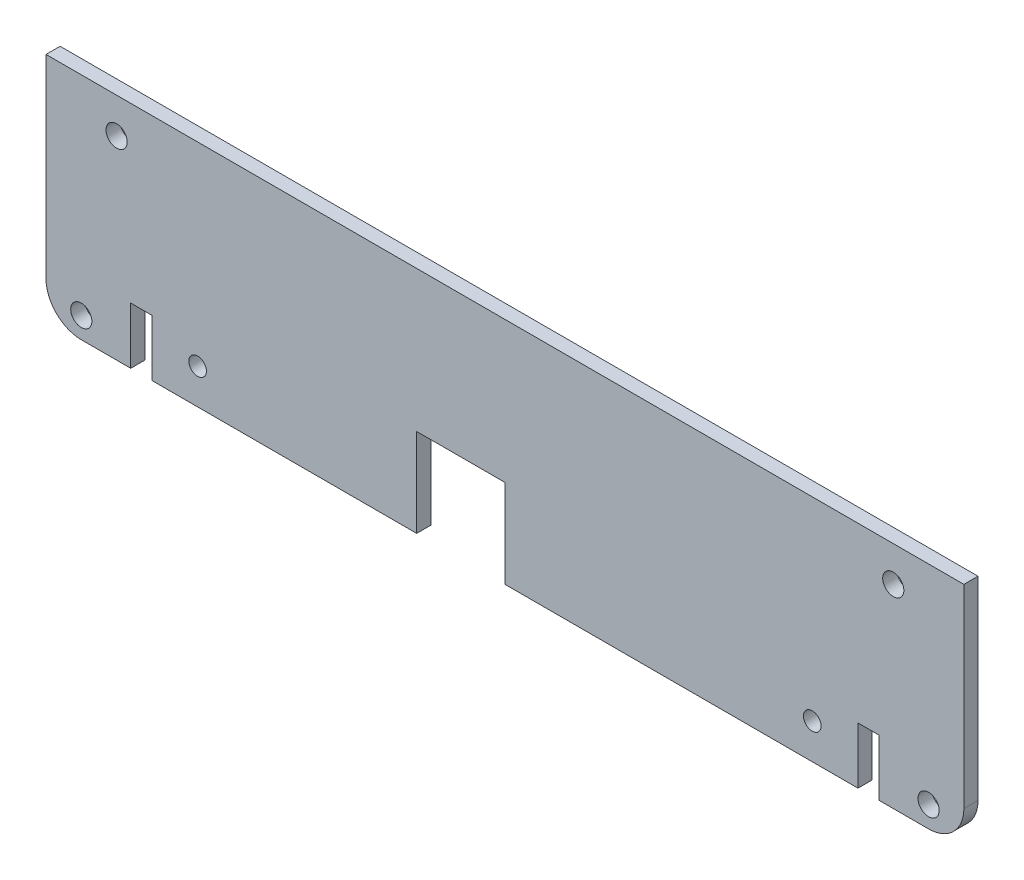
ISO-10303-21;
HEADER;
FILE_DESCRIPTION(('STEP AP214'),'2;1');
FILE_NAME('part.step','',(''),(''),'','','');
FILE_SCHEMA(('AUTOMOTIVE_DESIGN { 1 0 10303 214 1 1 1 1 }'));
ENDSEC;
DATA;
#1=APPLICATION_CONTEXT('core data for automotive mechanical design processes');
#2=APPLICATION_PROTOCOL_DEFINITION('international standard','automotive_design',2000,#1);
#3=PRODUCT_CONTEXT('',#1,'mechanical');
#4=PRODUCT('Part','Part','',(#3));
#5=PRODUCT_RELATED_PRODUCT_CATEGORY('part','',(#4));
#6=PRODUCT_DEFINITION_FORMATION('','',#4);
#7=PRODUCT_DEFINITION_CONTEXT('part definition',#1,'design');
#8=PRODUCT_DEFINITION('design','',#6,#7);
#9=PRODUCT_DEFINITION_SHAPE('','',#8);
#10=(LENGTH_UNIT() NAMED_UNIT(*) SI_UNIT(.MILLI.,.METRE.));
#11=(NAMED_UNIT(*) PLANE_ANGLE_UNIT() SI_UNIT($,.RADIAN.));
#12=(NAMED_UNIT(*) SI_UNIT($,.STERADIAN.) SOLID_ANGLE_UNIT());
#13=UNCERTAINTY_MEASURE_WITH_UNIT(LENGTH_MEASURE(1.E-05),#10,'distance_accuracy_value','');
#14=(GEOMETRIC_REPRESENTATION_CONTEXT(3) GLOBAL_UNCERTAINTY_ASSIGNED_CONTEXT((#13)) GLOBAL_UNIT_ASSIGNED_CONTEXT((#10,
#11,#12)) REPRESENTATION_CONTEXT('',''));
#15=CARTESIAN_POINT('',(0.,0.,0.));
#16=DIRECTION('',(0.,0.,1.));
#17=DIRECTION('',(1.,0.,0.));
#18=AXIS2_PLACEMENT_3D('',#15,#16,#17);
#19=CARTESIAN_POINT('',(-130.,-32.5,4.));
#20=DIRECTION('',(0.,1.,0.));
#21=DIRECTION('',(0.,0.,1.));
#22=AXIS2_PLACEMENT_3D('',#19,#20,#21);
#23=PLANE('',#22);
#24=DIRECTION('',(1.,0.,0.));
#25=VECTOR('',#24,1.);
#26=CARTESIAN_POINT('',(-130.,-32.5,4.));
#27=LINE('',#26,#25);
#28=CARTESIAN_POINT('',(-100.,-32.5,4.));
#29=VERTEX_POINT('',#28);
#30=CARTESIAN_POINT('',(-25.,-32.5,4.));
#31=VERTEX_POINT('',#30);
#32=EDGE_CURVE('E184',#29,#31,#27,.T.);
#33=ORIENTED_EDGE('',*,*,#32,.F.);
#34=DIRECTION('',(0.,0.,-1.));
#35=VECTOR('',#34,1.);
#36=CARTESIAN_POINT('',(-100.,-32.5,4.));
#37=LINE('',#36,#35);
#38=CARTESIAN_POINT('',(-100.,-32.5,0.));
#39=VERTEX_POINT('',#38);
#40=EDGE_CURVE('E274',#29,#39,#37,.T.);
#41=ORIENTED_EDGE('',*,*,#40,.T.);
#42=DIRECTION('',(1.,0.,0.));
#43=VECTOR('',#42,1.);
#44=CARTESIAN_POINT('',(-130.,-32.5,0.));
#45=LINE('',#44,#43);
#46=CARTESIAN_POINT('',(-25.,-32.5,0.));
#47=VERTEX_POINT('',#46);
#48=EDGE_CURVE('E333',#39,#47,#45,.T.);
#49=ORIENTED_EDGE('',*,*,#48,.T.);
#50=DIRECTION('',(0.,0.,-1.));
#51=VECTOR('',#50,1.);
#52=CARTESIAN_POINT('',(-25.,-32.5,10.));
#53=LINE('',#52,#51);
#54=EDGE_CURVE('E243',#31,#47,#53,.T.);
#55=ORIENTED_EDGE('',*,*,#54,.F.);
#56=EDGE_LOOP('',(#33,#41,#49,#55));
#57=FACE_BOUND('',#56,.T.);
#58=ADVANCED_FACE('F32',(#57),#23,.F.);
#59=CARTESIAN_POINT('',(106.,-32.5,4.));
#60=VERTEX_POINT('',#59);
#61=CARTESIAN_POINT('',(120.,-32.5,4.));
#62=VERTEX_POINT('',#61);
#63=EDGE_CURVE('E190',#60,#62,#27,.T.);
#64=ORIENTED_EDGE('',*,*,#63,.F.);
#65=DIRECTION('',(0.,0.,-1.));
#66=VECTOR('',#65,1.);
#67=CARTESIAN_POINT('',(106.,-32.5,4.));
#68=LINE('',#67,#66);
#69=CARTESIAN_POINT('',(106.,-32.5,0.));
#70=VERTEX_POINT('',#69);
#71=EDGE_CURVE('E258',#60,#70,#68,.T.);
#72=ORIENTED_EDGE('',*,*,#71,.T.);
#73=CARTESIAN_POINT('',(120.,-32.5,0.));
#74=VERTEX_POINT('',#73);
#75=EDGE_CURVE('E340',#70,#74,#45,.T.);
#76=ORIENTED_EDGE('',*,*,#75,.T.);
#77=DIRECTION('',(0.,0.,-1.));
#78=VECTOR('',#77,1.);
#79=CARTESIAN_POINT('',(120.,-32.5,4.));
#80=LINE('',#79,#78);
#81=EDGE_CURVE('E365',#74,#62,#80,.F.);
#82=ORIENTED_EDGE('',*,*,#81,.T.);
#83=EDGE_LOOP('',(#64,#72,#76,#82));
#84=FACE_BOUND('',#83,.T.);
#85=ADVANCED_FACE('F386',(#84),#23,.F.);
#86=CARTESIAN_POINT('',(0.,-32.5,0.));
#87=VERTEX_POINT('',#86);
#88=CARTESIAN_POINT('',(100.,-32.5,0.));
#89=VERTEX_POINT('',#88);
#90=EDGE_CURVE('E338',#87,#89,#45,.T.);
#91=ORIENTED_EDGE('',*,*,#90,.T.);
#92=DIRECTION('',(0.,0.,-1.));
#93=VECTOR('',#92,1.);
#94=CARTESIAN_POINT('',(100.,-32.5,4.));
#95=LINE('',#94,#93);
#96=CARTESIAN_POINT('',(100.,-32.5,4.));
#97=VERTEX_POINT('',#96);
#98=EDGE_CURVE('E55',#97,#89,#95,.T.);
#99=ORIENTED_EDGE('',*,*,#98,.F.);
#100=CARTESIAN_POINT('',(0.,-32.5,4.));
#101=VERTEX_POINT('',#100);
#102=EDGE_CURVE('E186',#101,#97,#27,.T.);
#103=ORIENTED_EDGE('',*,*,#102,.F.);
#104=DIRECTION('',(0.,0.,-1.));
#105=VECTOR('',#104,1.);
#106=CARTESIAN_POINT('',(0.,-32.5,10.));
#107=LINE('',#106,#105);
#108=EDGE_CURVE('E240',#101,#87,#107,.T.);
#109=ORIENTED_EDGE('',*,*,#108,.T.);
#110=EDGE_LOOP('',(#91,#99,#103,#109));
#111=FACE_BOUND('',#110,.T.);
#112=ADVANCED_FACE('F388',(#111),#23,.F.);
#113=CARTESIAN_POINT('',(130.,32.5,4.));
#114=DIRECTION('',(-1.,0.,0.));
#115=DIRECTION('',(0.,0.,1.));
#116=AXIS2_PLACEMENT_3D('',#113,#114,#115);
#117=PLANE('',#116);
#118=DIRECTION('',(0.,1.,0.));
#119=VECTOR('',#118,1.);
#120=CARTESIAN_POINT('',(130.,32.5,4.));
#121=LINE('',#120,#119);
#122=CARTESIAN_POINT('',(130.,-22.5,4.));
#123=VERTEX_POINT('',#122);
#124=CARTESIAN_POINT('',(130.,32.5,4.));
#125=VERTEX_POINT('',#124);
#126=EDGE_CURVE('E203',#123,#125,#121,.T.);
#127=ORIENTED_EDGE('',*,*,#126,.F.);
#128=DIRECTION('',(0.,0.,-1.));
#129=VECTOR('',#128,1.);
#130=CARTESIAN_POINT('',(130.,-22.5,4.));
#131=LINE('',#130,#129);
#132=CARTESIAN_POINT('',(130.,-22.5,0.));
#133=VERTEX_POINT('',#132);
#134=EDGE_CURVE('E11',#123,#133,#131,.T.);
#135=ORIENTED_EDGE('',*,*,#134,.T.);
#136=DIRECTION('',(0.,1.,0.));
#137=VECTOR('',#136,1.);
#138=CARTESIAN_POINT('',(130.,32.5,0.));
#139=LINE('',#138,#137);
#140=CARTESIAN_POINT('',(130.,32.5,0.));
#141=VERTEX_POINT('',#140);
#142=EDGE_CURVE('E214',#133,#141,#139,.T.);
#143=ORIENTED_EDGE('',*,*,#142,.T.);
#144=DIRECTION('',(0.,0.,-1.));
#145=VECTOR('',#144,1.);
#146=CARTESIAN_POINT('',(130.,32.5,4.));
#147=LINE('',#146,#145);
#148=EDGE_CURVE('E188',#125,#141,#147,.T.);
#149=ORIENTED_EDGE('',*,*,#148,.F.);
#150=EDGE_LOOP('',(#127,#135,#143,#149));
#151=FACE_BOUND('',#150,.T.);
#152=ADVANCED_FACE('F358',(#151),#117,.F.);
#153=CARTESIAN_POINT('',(-130.,32.5,4.));
#154=DIRECTION('',(0.,-1.,0.));
#155=DIRECTION('',(0.,0.,-1.));
#156=AXIS2_PLACEMENT_3D('',#153,#154,#155);
#157=PLANE('',#156);
#158=DIRECTION('',(-1.,0.,0.));
#159=VECTOR('',#158,1.);
#160=CARTESIAN_POINT('',(-130.,32.5,0.));
#161=LINE('',#160,#159);
#162=CARTESIAN_POINT('',(-130.,32.5,0.));
#163=VERTEX_POINT('',#162);
#164=EDGE_CURVE('E348',#141,#163,#161,.T.);
#165=ORIENTED_EDGE('',*,*,#164,.T.);
#166=DIRECTION('',(0.,0.,-1.));
#167=VECTOR('',#166,1.);
#168=CARTESIAN_POINT('',(-130.,32.5,4.));
#169=LINE('',#168,#167);
#170=CARTESIAN_POINT('',(-130.,32.5,4.));
#171=VERTEX_POINT('',#170);
#172=EDGE_CURVE('E183',#171,#163,#169,.T.);
#173=ORIENTED_EDGE('',*,*,#172,.F.);
#174=DIRECTION('',(-1.,0.,0.));
#175=VECTOR('',#174,1.);
#176=CARTESIAN_POINT('',(-130.,32.5,4.));
#177=LINE('',#176,#175);
#178=EDGE_CURVE('E201',#125,#171,#177,.T.);
#179=ORIENTED_EDGE('',*,*,#178,.F.);
#180=ORIENTED_EDGE('',*,*,#148,.T.);
#181=EDGE_LOOP('',(#165,#173,#179,#180));
#182=FACE_BOUND('',#181,.T.);
#183=ADVANCED_FACE('F364',(#182),#157,.F.);
#184=CARTESIAN_POINT('',(-130.,32.5,4.));
#185=DIRECTION('',(1.,0.,0.));
#186=DIRECTION('',(0.,0.,-1.));
#187=AXIS2_PLACEMENT_3D('',#184,#185,#186);
#188=PLANE('',#187);
#189=DIRECTION('',(0.,-1.,0.));
#190=VECTOR('',#189,1.);
#191=CARTESIAN_POINT('',(-130.,32.5,0.));
#192=LINE('',#191,#190);
#193=CARTESIAN_POINT('',(-130.,-22.5,0.));
#194=VERTEX_POINT('',#193);
#195=EDGE_CURVE('E343',#163,#194,#192,.T.);
#196=ORIENTED_EDGE('',*,*,#195,.T.);
#197=DIRECTION('',(0.,0.,-1.));
#198=VECTOR('',#197,1.);
#199=CARTESIAN_POINT('',(-130.,-22.5,4.));
#200=LINE('',#199,#198);
#201=CARTESIAN_POINT('',(-130.,-22.5,4.));
#202=VERTEX_POINT('',#201);
#203=EDGE_CURVE('E375',#194,#202,#200,.F.);
#204=ORIENTED_EDGE('',*,*,#203,.T.);
#205=DIRECTION('',(0.,-1.,0.));
#206=VECTOR('',#205,1.);
#207=CARTESIAN_POINT('',(-130.,32.5,4.));
#208=LINE('',#207,#206);
#209=EDGE_CURVE('E197',#171,#202,#208,.T.);
#210=ORIENTED_EDGE('',*,*,#209,.F.);
#211=ORIENTED_EDGE('',*,*,#172,.T.);
#212=EDGE_LOOP('',(#196,#204,#210,#211));
#213=FACE_BOUND('',#212,.T.);
#214=ADVANCED_FACE('F397',(#213),#188,.F.);
#215=CARTESIAN_POINT('',(-120.,-32.5,0.));
#216=VERTEX_POINT('',#215);
#217=CARTESIAN_POINT('',(-106.,-32.5,0.));
#218=VERTEX_POINT('',#217);
#219=EDGE_CURVE('E175',#216,#218,#45,.T.);
#220=ORIENTED_EDGE('',*,*,#219,.T.);
#221=DIRECTION('',(0.,0.,-1.));
#222=VECTOR('',#221,1.);
#223=CARTESIAN_POINT('',(-106.,-32.5,4.));
#224=LINE('',#223,#222);
#225=CARTESIAN_POINT('',(-106.,-32.5,4.));
#226=VERTEX_POINT('',#225);
#227=EDGE_CURVE('E47',#226,#218,#224,.T.);
#228=ORIENTED_EDGE('',*,*,#227,.F.);
#229=CARTESIAN_POINT('',(-120.,-32.5,4.));
#230=VERTEX_POINT('',#229);
#231=EDGE_CURVE('E172',#230,#226,#27,.T.);
#232=ORIENTED_EDGE('',*,*,#231,.F.);
#233=DIRECTION('',(0.,0.,-1.));
#234=VECTOR('',#233,1.);
#235=CARTESIAN_POINT('',(-120.,-32.5,4.));
#236=LINE('',#235,#234);
#237=EDGE_CURVE('E367',#230,#216,#236,.T.);
#238=ORIENTED_EDGE('',*,*,#237,.T.);
#239=EDGE_LOOP('',(#220,#228,#232,#238));
#240=FACE_BOUND('',#239,.T.);
#241=ADVANCED_FACE('F170',(#240),#23,.F.);
#242=CARTESIAN_POINT('',(0.,0.,4.));
#243=DIRECTION('',(0.,0.,1.));
#244=DIRECTION('',(1.,0.,0.));
#245=AXIS2_PLACEMENT_3D('',#242,#243,#244);
#246=PLANE('',#245);
#247=CARTESIAN_POINT('',(87.05,-22.5000000000007,4.));
#248=DIRECTION('',(0.,0.,-1.));
#249=DIRECTION('',(-1.,0.,0.));
#250=AXIS2_PLACEMENT_3D('',#247,#248,#249);
#251=CIRCLE('',#250,2.50000000000011);
#252=CARTESIAN_POINT('',(84.5499999999999,-22.5000000000007,4.));
#253=VERTEX_POINT('',#252);
#254=EDGE_CURVE('E297',#253,#253,#251,.T.);
#255=ORIENTED_EDGE('',*,*,#254,.T.);
#256=EDGE_LOOP('',(#255));
#257=FACE_BOUND('',#256,.T.);
#258=CARTESIAN_POINT('',(-87.05,-22.5000000000007,4.));
#259=DIRECTION('',(0.,0.,-1.));
#260=DIRECTION('',(-1.,0.,0.));
#261=AXIS2_PLACEMENT_3D('',#258,#259,#260);
#262=CIRCLE('',#261,2.50000000000019);
#263=CARTESIAN_POINT('',(-89.5500000000002,-22.5000000000007,4.));
#264=VERTEX_POINT('',#263);
#265=EDGE_CURVE('E291',#264,#264,#262,.T.);
#266=ORIENTED_EDGE('',*,*,#265,.T.);
#267=EDGE_LOOP('',(#266));
#268=FACE_BOUND('',#267,.T.);
#269=DIRECTION('',(0.,-1.,0.));
#270=VECTOR('',#269,1.);
#271=CARTESIAN_POINT('',(-100.,-32.5,4.));
#272=LINE('',#271,#270);
#273=CARTESIAN_POINT('',(-100.,-16.5,4.));
#274=VERTEX_POINT('',#273);
#275=EDGE_CURVE('E176',#274,#29,#272,.T.);
#276=ORIENTED_EDGE('',*,*,#275,.T.);
#277=ORIENTED_EDGE('',*,*,#32,.T.);
#278=DIRECTION('',(0.,-1.,0.));
#279=VECTOR('',#278,1.);
#280=CARTESIAN_POINT('',(-25.,0.,4.));
#281=LINE('',#280,#279);
#282=CARTESIAN_POINT('',(-25.,-7.49999999999998,4.));
#283=VERTEX_POINT('',#282);
#284=EDGE_CURVE('E236',#283,#31,#281,.T.);
#285=ORIENTED_EDGE('',*,*,#284,.F.);
#286=DIRECTION('',(-1.,0.,0.));
#287=VECTOR('',#286,1.);
#288=CARTESIAN_POINT('',(0.,-7.49999999999998,4.));
#289=LINE('',#288,#287);
#290=CARTESIAN_POINT('',(0.,-7.49999999999998,4.));
#291=VERTEX_POINT('',#290);
#292=EDGE_CURVE('E234',#291,#283,#289,.T.);
#293=ORIENTED_EDGE('',*,*,#292,.F.);
#294=DIRECTION('',(0.,1.,0.));
#295=VECTOR('',#294,1.);
#296=CARTESIAN_POINT('',(0.,0.,4.));
#297=LINE('',#296,#295);
#298=EDGE_CURVE('E225',#101,#291,#297,.T.);
#299=ORIENTED_EDGE('',*,*,#298,.F.);
#300=ORIENTED_EDGE('',*,*,#102,.T.);
#301=DIRECTION('',(0.,1.,0.));
#302=VECTOR('',#301,1.);
#303=CARTESIAN_POINT('',(100.,-32.5,4.));
#304=LINE('',#303,#302);
#305=CARTESIAN_POINT('',(100.,-16.5,4.));
#306=VERTEX_POINT('',#305);
#307=EDGE_CURVE('E277',#97,#306,#304,.T.);
#308=ORIENTED_EDGE('',*,*,#307,.T.);
#309=DIRECTION('',(1.,0.,0.));
#310=VECTOR('',#309,1.);
#311=CARTESIAN_POINT('',(106.,-16.5,4.));
#312=LINE('',#311,#310);
#313=CARTESIAN_POINT('',(106.,-16.5,4.));
#314=VERTEX_POINT('',#313);
#315=EDGE_CURVE('E261',#306,#314,#312,.T.);
#316=ORIENTED_EDGE('',*,*,#315,.T.);
#317=DIRECTION('',(0.,-1.,0.));
#318=VECTOR('',#317,1.);
#319=CARTESIAN_POINT('',(106.,-32.5,4.));
#320=LINE('',#319,#318);
#321=EDGE_CURVE('E269',#314,#60,#320,.T.);
#322=ORIENTED_EDGE('',*,*,#321,.T.);
#323=ORIENTED_EDGE('',*,*,#63,.T.);
#324=CARTESIAN_POINT('',(120.,-22.5,4.));
#325=DIRECTION('',(0.,0.,1.));
#326=DIRECTION('',(1.,0.,0.));
#327=AXIS2_PLACEMENT_3D('',#324,#325,#326);
#328=CIRCLE('',#327,10.);
#329=EDGE_CURVE('E377',#62,#123,#328,.T.);
#330=ORIENTED_EDGE('',*,*,#329,.T.);
#331=ORIENTED_EDGE('',*,*,#126,.T.);
#332=ORIENTED_EDGE('',*,*,#178,.T.);
#333=ORIENTED_EDGE('',*,*,#209,.T.);
#334=CARTESIAN_POINT('',(-120.,-22.5,4.));
#335=DIRECTION('',(0.,0.,1.));
#336=DIRECTION('',(1.,0.,0.));
#337=AXIS2_PLACEMENT_3D('',#334,#335,#336);
#338=CIRCLE('',#337,10.);
#339=EDGE_CURVE('E40',#202,#230,#338,.T.);
#340=ORIENTED_EDGE('',*,*,#339,.T.);
#341=ORIENTED_EDGE('',*,*,#231,.T.);
#342=DIRECTION('',(0.,1.,0.));
#343=VECTOR('',#342,1.);
#344=CARTESIAN_POINT('',(-106.,-32.5,4.));
#345=LINE('',#344,#343);
#346=CARTESIAN_POINT('',(-106.,-16.5,4.));
#347=VERTEX_POINT('',#346);
#348=EDGE_CURVE('E157',#226,#347,#345,.T.);
#349=ORIENTED_EDGE('',*,*,#348,.T.);
#350=DIRECTION('',(1.,0.,0.));
#351=VECTOR('',#350,1.);
#352=CARTESIAN_POINT('',(-106.,-16.5,4.));
#353=LINE('',#352,#351);
#354=EDGE_CURVE('E164',#347,#274,#353,.T.);
#355=ORIENTED_EDGE('',*,*,#354,.T.);
#356=EDGE_LOOP('',(#276,#277,#285,#293,#299,#300,#308,#316,#322,#323,#330,#331,#332,#333,#340,
#341,#349,#355));
#357=FACE_BOUND('',#356,.T.);
#358=CARTESIAN_POINT('',(120.,-26.5,4.));
#359=DIRECTION('',(0.,0.,-1.));
#360=DIRECTION('',(-1.,0.,0.));
#361=AXIS2_PLACEMENT_3D('',#358,#359,#360);
#362=CIRCLE('',#361,3.00000000000001);
#363=CARTESIAN_POINT('',(117.,-26.5,4.));
#364=VERTEX_POINT('',#363);
#365=EDGE_CURVE('E224',#364,#364,#362,.T.);
#366=ORIENTED_EDGE('',*,*,#365,.T.);
#367=EDGE_LOOP('',(#366));
#368=FACE_BOUND('',#367,.T.);
#369=CARTESIAN_POINT('',(-110.,22.4999999999999,4.));
#370=DIRECTION('',(0.,0.,-1.));
#371=DIRECTION('',(-1.,0.,0.));
#372=AXIS2_PLACEMENT_3D('',#369,#370,#371);
#373=CIRCLE('',#372,3.00000000000001);
#374=CARTESIAN_POINT('',(-113.,22.4999999999999,4.));
#375=VERTEX_POINT('',#374);
#376=EDGE_CURVE('E218',#375,#375,#373,.T.);
#377=ORIENTED_EDGE('',*,*,#376,.T.);
#378=EDGE_LOOP('',(#377));
#379=FACE_BOUND('',#378,.T.);
#380=CARTESIAN_POINT('',(110.,22.5,4.));
#381=DIRECTION('',(0.,0.,-1.));
#382=DIRECTION('',(-1.,0.,0.));
#383=AXIS2_PLACEMENT_3D('',#380,#381,#382);
#384=CIRCLE('',#383,3.);
#385=CARTESIAN_POINT('',(107.,22.5,4.));
#386=VERTEX_POINT('',#385);
#387=EDGE_CURVE('E211',#386,#386,#384,.T.);
#388=ORIENTED_EDGE('',*,*,#387,.T.);
#389=EDGE_LOOP('',(#388));
#390=FACE_BOUND('',#389,.T.);
#391=CARTESIAN_POINT('',(-120.,-26.5,4.));
#392=DIRECTION('',(0.,0.,-1.));
#393=DIRECTION('',(-1.,0.,0.));
#394=AXIS2_PLACEMENT_3D('',#391,#392,#393);
#395=CIRCLE('',#394,2.99999999999999);
#396=CARTESIAN_POINT('',(-123.,-26.5,4.));
#397=VERTEX_POINT('',#396);
#398=EDGE_CURVE('E210',#397,#397,#395,.T.);
#399=ORIENTED_EDGE('',*,*,#398,.T.);
#400=EDGE_LOOP('',(#399));
#401=FACE_BOUND('',#400,.T.);
#402=ADVANCED_FACE('F179',(#257,#268,#357,#368,#379,#390,#401),#246,.T.);
#403=CARTESIAN_POINT('',(0.,0.,0.));
#404=DIRECTION('',(0.,0.,1.));
#405=DIRECTION('',(1.,0.,0.));
#406=AXIS2_PLACEMENT_3D('',#403,#404,#405);
#407=PLANE('',#406);
#408=CARTESIAN_POINT('',(87.05,-22.5000000000007,0.));
#409=DIRECTION('',(0.,0.,-1.));
#410=DIRECTION('',(-1.,0.,0.));
#411=AXIS2_PLACEMENT_3D('',#408,#409,#410);
#412=CIRCLE('',#411,2.50000000000011);
#413=CARTESIAN_POINT('',(84.5499999999999,-22.5000000000007,0.));
#414=VERTEX_POINT('',#413);
#415=EDGE_CURVE('E300',#414,#414,#412,.T.);
#416=ORIENTED_EDGE('',*,*,#415,.F.);
#417=EDGE_LOOP('',(#416));
#418=FACE_BOUND('',#417,.T.);
#419=CARTESIAN_POINT('',(-87.05,-22.5000000000007,0.));
#420=DIRECTION('',(0.,0.,-1.));
#421=DIRECTION('',(-1.,0.,0.));
#422=AXIS2_PLACEMENT_3D('',#419,#420,#421);
#423=CIRCLE('',#422,2.50000000000019);
#424=CARTESIAN_POINT('',(-89.5500000000002,-22.5000000000007,0.));
#425=VERTEX_POINT('',#424);
#426=EDGE_CURVE('E294',#425,#425,#423,.T.);
#427=ORIENTED_EDGE('',*,*,#426,.F.);
#428=EDGE_LOOP('',(#427));
#429=FACE_BOUND('',#428,.T.);
#430=CARTESIAN_POINT('',(120.,-26.5,0.));
#431=DIRECTION('',(0.,0.,-1.));
#432=DIRECTION('',(-1.,0.,0.));
#433=AXIS2_PLACEMENT_3D('',#430,#431,#432);
#434=CIRCLE('',#433,3.00000000000001);
#435=CARTESIAN_POINT('',(117.,-26.5,0.));
#436=VERTEX_POINT('',#435);
#437=EDGE_CURVE('E221',#436,#436,#434,.T.);
#438=ORIENTED_EDGE('',*,*,#437,.F.);
#439=EDGE_LOOP('',(#438));
#440=FACE_BOUND('',#439,.T.);
#441=CARTESIAN_POINT('',(-110.,22.4999999999999,0.));
#442=DIRECTION('',(0.,0.,-1.));
#443=DIRECTION('',(-1.,0.,0.));
#444=AXIS2_PLACEMENT_3D('',#441,#442,#443);
#445=CIRCLE('',#444,3.00000000000001);
#446=CARTESIAN_POINT('',(-113.,22.4999999999999,0.));
#447=VERTEX_POINT('',#446);
#448=EDGE_CURVE('E228',#447,#447,#445,.T.);
#449=ORIENTED_EDGE('',*,*,#448,.F.);
#450=EDGE_LOOP('',(#449));
#451=FACE_BOUND('',#450,.T.);
#452=CARTESIAN_POINT('',(110.,22.5,0.));
#453=DIRECTION('',(0.,0.,-1.));
#454=DIRECTION('',(-1.,0.,0.));
#455=AXIS2_PLACEMENT_3D('',#452,#453,#454);
#456=CIRCLE('',#455,3.);
#457=CARTESIAN_POINT('',(107.,22.5,0.));
#458=VERTEX_POINT('',#457);
#459=EDGE_CURVE('E215',#458,#458,#456,.T.);
#460=ORIENTED_EDGE('',*,*,#459,.F.);
#461=EDGE_LOOP('',(#460));
#462=FACE_BOUND('',#461,.T.);
#463=CARTESIAN_POINT('',(-120.,-26.5,0.));
#464=DIRECTION('',(0.,0.,-1.));
#465=DIRECTION('',(-1.,0.,0.));
#466=AXIS2_PLACEMENT_3D('',#463,#464,#465);
#467=CIRCLE('',#466,2.99999999999999);
#468=CARTESIAN_POINT('',(-123.,-26.5,0.));
#469=VERTEX_POINT('',#468);
#470=EDGE_CURVE('E207',#469,#469,#467,.T.);
#471=ORIENTED_EDGE('',*,*,#470,.F.);
#472=EDGE_LOOP('',(#471));
#473=FACE_BOUND('',#472,.T.);
#474=ORIENTED_EDGE('',*,*,#48,.F.);
#475=DIRECTION('',(0.,-1.,0.));
#476=VECTOR('',#475,1.);
#477=CARTESIAN_POINT('',(-100.,-32.5,0.));
#478=LINE('',#477,#476);
#479=CARTESIAN_POINT('',(-100.,-16.5,0.));
#480=VERTEX_POINT('',#479);
#481=EDGE_CURVE('E165',#480,#39,#478,.T.);
#482=ORIENTED_EDGE('',*,*,#481,.F.);
#483=DIRECTION('',(1.,0.,0.));
#484=VECTOR('',#483,1.);
#485=CARTESIAN_POINT('',(-106.,-16.5,0.));
#486=LINE('',#485,#484);
#487=CARTESIAN_POINT('',(-106.,-16.5,0.));
#488=VERTEX_POINT('',#487);
#489=EDGE_CURVE('E286',#488,#480,#486,.T.);
#490=ORIENTED_EDGE('',*,*,#489,.F.);
#491=DIRECTION('',(0.,1.,0.));
#492=VECTOR('',#491,1.);
#493=CARTESIAN_POINT('',(-106.,-32.5,0.));
#494=LINE('',#493,#492);
#495=EDGE_CURVE('E289',#218,#488,#494,.T.);
#496=ORIENTED_EDGE('',*,*,#495,.F.);
#497=ORIENTED_EDGE('',*,*,#219,.F.);
#498=CARTESIAN_POINT('',(-120.,-22.5,0.));
#499=DIRECTION('',(0.,0.,1.));
#500=DIRECTION('',(1.,0.,0.));
#501=AXIS2_PLACEMENT_3D('',#498,#499,#500);
#502=CIRCLE('',#501,10.);
#503=EDGE_CURVE('E373',#216,#194,#502,.F.);
#504=ORIENTED_EDGE('',*,*,#503,.T.);
#505=ORIENTED_EDGE('',*,*,#195,.F.);
#506=ORIENTED_EDGE('',*,*,#164,.F.);
#507=ORIENTED_EDGE('',*,*,#142,.F.);
#508=CARTESIAN_POINT('',(120.,-22.5,0.));
#509=DIRECTION('',(0.,0.,1.));
#510=DIRECTION('',(1.,0.,0.));
#511=AXIS2_PLACEMENT_3D('',#508,#509,#510);
#512=CIRCLE('',#511,10.);
#513=EDGE_CURVE('E371',#133,#74,#512,.F.);
#514=ORIENTED_EDGE('',*,*,#513,.T.);
#515=ORIENTED_EDGE('',*,*,#75,.F.);
#516=DIRECTION('',(0.,-1.,0.));
#517=VECTOR('',#516,1.);
#518=CARTESIAN_POINT('',(106.,-32.5,0.));
#519=LINE('',#518,#517);
#520=CARTESIAN_POINT('',(106.,-16.5,0.));
#521=VERTEX_POINT('',#520);
#522=EDGE_CURVE('E272',#521,#70,#519,.T.);
#523=ORIENTED_EDGE('',*,*,#522,.F.);
#524=DIRECTION('',(1.,0.,0.));
#525=VECTOR('',#524,1.);
#526=CARTESIAN_POINT('',(106.,-16.5,0.));
#527=LINE('',#526,#525);
#528=CARTESIAN_POINT('',(100.,-16.5,0.));
#529=VERTEX_POINT('',#528);
#530=EDGE_CURVE('E266',#529,#521,#527,.T.);
#531=ORIENTED_EDGE('',*,*,#530,.F.);
#532=DIRECTION('',(0.,1.,0.));
#533=VECTOR('',#532,1.);
#534=CARTESIAN_POINT('',(100.,-32.5,0.));
#535=LINE('',#534,#533);
#536=EDGE_CURVE('E270',#89,#529,#535,.T.);
#537=ORIENTED_EDGE('',*,*,#536,.F.);
#538=ORIENTED_EDGE('',*,*,#90,.F.);
#539=DIRECTION('',(0.,-1.,0.));
#540=VECTOR('',#539,1.);
#541=CARTESIAN_POINT('',(0.,-32.5,0.));
#542=LINE('',#541,#540);
#543=CARTESIAN_POINT('',(0.,-7.49999999999998,0.));
#544=VERTEX_POINT('',#543);
#545=EDGE_CURVE('E255',#544,#87,#542,.T.);
#546=ORIENTED_EDGE('',*,*,#545,.F.);
#547=DIRECTION('',(1.,0.,0.));
#548=VECTOR('',#547,1.);
#549=CARTESIAN_POINT('',(0.,-7.49999999999998,0.));
#550=LINE('',#549,#548);
#551=CARTESIAN_POINT('',(-25.,-7.49999999999998,0.));
#552=VERTEX_POINT('',#551);
#553=EDGE_CURVE('E244',#552,#544,#550,.T.);
#554=ORIENTED_EDGE('',*,*,#553,.F.);
#555=DIRECTION('',(0.,1.,0.));
#556=VECTOR('',#555,1.);
#557=CARTESIAN_POINT('',(-25.,-32.5,0.));
#558=LINE('',#557,#556);
#559=EDGE_CURVE('E252',#47,#552,#558,.T.);
#560=ORIENTED_EDGE('',*,*,#559,.F.);
#561=EDGE_LOOP('',(#474,#482,#490,#496,#497,#504,#505,#506,#507,#514,#515,#523,#531,#537,#538,
#546,#554,#560));
#562=FACE_BOUND('',#561,.T.);
#563=ADVANCED_FACE('F315',(#418,#429,#440,#451,#462,#473,#562),#407,.F.);
#564=CARTESIAN_POINT('',(-120.,-26.5,4.));
#565=DIRECTION('',(0.,0.,-1.));
#566=DIRECTION('',(-1.,0.,0.));
#567=AXIS2_PLACEMENT_3D('',#564,#565,#566);
#568=CYLINDRICAL_SURFACE('',#567,2.99999999999999);
#569=ORIENTED_EDGE('',*,*,#398,.F.);
#570=EDGE_LOOP('',(#569));
#571=FACE_BOUND('',#570,.T.);
#572=ORIENTED_EDGE('',*,*,#470,.T.);
#573=EDGE_LOOP('',(#572));
#574=FACE_BOUND('',#573,.T.);
#575=ADVANCED_FACE('F318',(#571,#574),#568,.F.);
#576=CARTESIAN_POINT('',(110.,22.5,4.));
#577=DIRECTION('',(0.,0.,-1.));
#578=DIRECTION('',(-1.,0.,0.));
#579=AXIS2_PLACEMENT_3D('',#576,#577,#578);
#580=CYLINDRICAL_SURFACE('',#579,3.);
#581=ORIENTED_EDGE('',*,*,#387,.F.);
#582=EDGE_LOOP('',(#581));
#583=FACE_BOUND('',#582,.T.);
#584=ORIENTED_EDGE('',*,*,#459,.T.);
#585=EDGE_LOOP('',(#584));
#586=FACE_BOUND('',#585,.T.);
#587=ADVANCED_FACE('F455',(#583,#586),#580,.F.);
#588=CARTESIAN_POINT('',(-110.,22.4999999999999,4.));
#589=DIRECTION('',(0.,0.,-1.));
#590=DIRECTION('',(-1.,0.,0.));
#591=AXIS2_PLACEMENT_3D('',#588,#589,#590);
#592=CYLINDRICAL_SURFACE('',#591,3.00000000000001);
#593=ORIENTED_EDGE('',*,*,#376,.F.);
#594=EDGE_LOOP('',(#593));
#595=FACE_BOUND('',#594,.T.);
#596=ORIENTED_EDGE('',*,*,#448,.T.);
#597=EDGE_LOOP('',(#596));
#598=FACE_BOUND('',#597,.T.);
#599=ADVANCED_FACE('F413',(#595,#598),#592,.F.);
#600=CARTESIAN_POINT('',(120.,-26.5,4.));
#601=DIRECTION('',(0.,0.,-1.));
#602=DIRECTION('',(-1.,0.,0.));
#603=AXIS2_PLACEMENT_3D('',#600,#601,#602);
#604=CYLINDRICAL_SURFACE('',#603,3.00000000000001);
#605=ORIENTED_EDGE('',*,*,#365,.F.);
#606=EDGE_LOOP('',(#605));
#607=FACE_BOUND('',#606,.T.);
#608=ORIENTED_EDGE('',*,*,#437,.T.);
#609=EDGE_LOOP('',(#608));
#610=FACE_BOUND('',#609,.T.);
#611=ADVANCED_FACE('F406',(#607,#610),#604,.F.);
#612=CARTESIAN_POINT('',(-120.,-22.5,4.));
#613=DIRECTION('',(0.,0.,-1.));
#614=DIRECTION('',(-1.,0.,0.));
#615=AXIS2_PLACEMENT_3D('',#612,#613,#614);
#616=CYLINDRICAL_SURFACE('',#615,10.);
#617=ORIENTED_EDGE('',*,*,#339,.F.);
#618=ORIENTED_EDGE('',*,*,#203,.F.);
#619=ORIENTED_EDGE('',*,*,#503,.F.);
#620=ORIENTED_EDGE('',*,*,#237,.F.);
#621=EDGE_LOOP('',(#617,#618,#619,#620));
#622=FACE_BOUND('',#621,.T.);
#623=ADVANCED_FACE('F404',(#622),#616,.T.);
#624=CARTESIAN_POINT('',(120.,-22.5,4.));
#625=DIRECTION('',(0.,0.,-1.));
#626=DIRECTION('',(-1.,0.,0.));
#627=AXIS2_PLACEMENT_3D('',#624,#625,#626);
#628=CYLINDRICAL_SURFACE('',#627,10.);
#629=ORIENTED_EDGE('',*,*,#329,.F.);
#630=ORIENTED_EDGE('',*,*,#81,.F.);
#631=ORIENTED_EDGE('',*,*,#513,.F.);
#632=ORIENTED_EDGE('',*,*,#134,.F.);
#633=EDGE_LOOP('',(#629,#630,#631,#632));
#634=FACE_BOUND('',#633,.T.);
#635=ADVANCED_FACE('F34',(#634),#628,.T.);
#636=CARTESIAN_POINT('',(0.,-32.5,10.));
#637=DIRECTION('',(1.,0.,0.));
#638=DIRECTION('',(0.,1.,0.));
#639=AXIS2_PLACEMENT_3D('',#636,#637,#638);
#640=PLANE('',#639);
#641=ORIENTED_EDGE('',*,*,#298,.T.);
#642=DIRECTION('',(0.,0.,-1.));
#643=VECTOR('',#642,1.);
#644=CARTESIAN_POINT('',(0.,-7.49999999999998,10.));
#645=LINE('',#644,#643);
#646=EDGE_CURVE('E239',#291,#544,#645,.T.);
#647=ORIENTED_EDGE('',*,*,#646,.T.);
#648=ORIENTED_EDGE('',*,*,#545,.T.);
#649=ORIENTED_EDGE('',*,*,#108,.F.);
#650=EDGE_LOOP('',(#641,#647,#648,#649));
#651=FACE_BOUND('',#650,.T.);
#652=ADVANCED_FACE('F412',(#651),#640,.F.);
#653=CARTESIAN_POINT('',(0.,-7.49999999999998,10.));
#654=DIRECTION('',(0.,1.,0.));
#655=DIRECTION('',(0.,0.,1.));
#656=AXIS2_PLACEMENT_3D('',#653,#654,#655);
#657=PLANE('',#656);
#658=ORIENTED_EDGE('',*,*,#292,.T.);
#659=DIRECTION('',(0.,0.,-1.));
#660=VECTOR('',#659,1.);
#661=CARTESIAN_POINT('',(-25.,-7.49999999999998,10.));
#662=LINE('',#661,#660);
#663=EDGE_CURVE('E247',#283,#552,#662,.T.);
#664=ORIENTED_EDGE('',*,*,#663,.T.);
#665=ORIENTED_EDGE('',*,*,#553,.T.);
#666=ORIENTED_EDGE('',*,*,#646,.F.);
#667=EDGE_LOOP('',(#658,#664,#665,#666));
#668=FACE_BOUND('',#667,.T.);
#669=ADVANCED_FACE('F428',(#668),#657,.F.);
#670=CARTESIAN_POINT('',(-25.,-32.5,10.));
#671=DIRECTION('',(-1.,0.,0.));
#672=DIRECTION('',(0.,0.,1.));
#673=AXIS2_PLACEMENT_3D('',#670,#671,#672);
#674=PLANE('',#673);
#675=ORIENTED_EDGE('',*,*,#284,.T.);
#676=ORIENTED_EDGE('',*,*,#54,.T.);
#677=ORIENTED_EDGE('',*,*,#559,.T.);
#678=ORIENTED_EDGE('',*,*,#663,.F.);
#679=EDGE_LOOP('',(#675,#676,#677,#678));
#680=FACE_BOUND('',#679,.T.);
#681=ADVANCED_FACE('F423',(#680),#674,.F.);
#682=CARTESIAN_POINT('',(106.,-32.5,4.));
#683=DIRECTION('',(1.,0.,0.));
#684=DIRECTION('',(0.,0.,-1.));
#685=AXIS2_PLACEMENT_3D('',#682,#683,#684);
#686=PLANE('',#685);
#687=ORIENTED_EDGE('',*,*,#522,.T.);
#688=ORIENTED_EDGE('',*,*,#71,.F.);
#689=ORIENTED_EDGE('',*,*,#321,.F.);
#690=DIRECTION('',(0.,0.,-1.));
#691=VECTOR('',#690,1.);
#692=CARTESIAN_POINT('',(106.,-16.5,4.));
#693=LINE('',#692,#691);
#694=EDGE_CURVE('E257',#314,#521,#693,.T.);
#695=ORIENTED_EDGE('',*,*,#694,.T.);
#696=EDGE_LOOP('',(#687,#688,#689,#695));
#697=FACE_BOUND('',#696,.T.);
#698=ADVANCED_FACE('F384',(#697),#686,.F.);
#699=CARTESIAN_POINT('',(106.,-16.5,4.));
#700=DIRECTION('',(0.,1.,0.));
#701=DIRECTION('',(0.,0.,1.));
#702=AXIS2_PLACEMENT_3D('',#699,#700,#701);
#703=PLANE('',#702);
#704=ORIENTED_EDGE('',*,*,#530,.T.);
#705=ORIENTED_EDGE('',*,*,#694,.F.);
#706=ORIENTED_EDGE('',*,*,#315,.F.);
#707=DIRECTION('',(0.,0.,-1.));
#708=VECTOR('',#707,1.);
#709=CARTESIAN_POINT('',(100.,-16.5,4.));
#710=LINE('',#709,#708);
#711=EDGE_CURVE('E263',#306,#529,#710,.T.);
#712=ORIENTED_EDGE('',*,*,#711,.T.);
#713=EDGE_LOOP('',(#704,#705,#706,#712));
#714=FACE_BOUND('',#713,.T.);
#715=ADVANCED_FACE('F435',(#714),#703,.F.);
#716=CARTESIAN_POINT('',(100.,-32.5,4.));
#717=DIRECTION('',(-1.,0.,0.));
#718=DIRECTION('',(0.,0.,1.));
#719=AXIS2_PLACEMENT_3D('',#716,#717,#718);
#720=PLANE('',#719);
#721=ORIENTED_EDGE('',*,*,#536,.T.);
#722=ORIENTED_EDGE('',*,*,#711,.F.);
#723=ORIENTED_EDGE('',*,*,#307,.F.);
#724=ORIENTED_EDGE('',*,*,#98,.T.);
#725=EDGE_LOOP('',(#721,#722,#723,#724));
#726=FACE_BOUND('',#725,.T.);
#727=ADVANCED_FACE('F432',(#726),#720,.F.);
#728=CARTESIAN_POINT('',(-100.,-32.5,4.));
#729=DIRECTION('',(1.,0.,0.));
#730=DIRECTION('',(0.,0.,-1.));
#731=AXIS2_PLACEMENT_3D('',#728,#729,#730);
#732=PLANE('',#731);
#733=ORIENTED_EDGE('',*,*,#481,.T.);
#734=ORIENTED_EDGE('',*,*,#40,.F.);
#735=ORIENTED_EDGE('',*,*,#275,.F.);
#736=DIRECTION('',(0.,0.,-1.));
#737=VECTOR('',#736,1.);
#738=CARTESIAN_POINT('',(-100.,-16.5,4.));
#739=LINE('',#738,#737);
#740=EDGE_CURVE('E281',#274,#480,#739,.T.);
#741=ORIENTED_EDGE('',*,*,#740,.T.);
#742=EDGE_LOOP('',(#733,#734,#735,#741));
#743=FACE_BOUND('',#742,.T.);
#744=ADVANCED_FACE('F442',(#743),#732,.F.);
#745=CARTESIAN_POINT('',(-106.,-16.5,4.));
#746=DIRECTION('',(0.,1.,0.));
#747=DIRECTION('',(0.,0.,1.));
#748=AXIS2_PLACEMENT_3D('',#745,#746,#747);
#749=PLANE('',#748);
#750=ORIENTED_EDGE('',*,*,#489,.T.);
#751=ORIENTED_EDGE('',*,*,#740,.F.);
#752=ORIENTED_EDGE('',*,*,#354,.F.);
#753=DIRECTION('',(0.,0.,-1.));
#754=VECTOR('',#753,1.);
#755=CARTESIAN_POINT('',(-106.,-16.5,4.));
#756=LINE('',#755,#754);
#757=EDGE_CURVE('E159',#347,#488,#756,.T.);
#758=ORIENTED_EDGE('',*,*,#757,.T.);
#759=EDGE_LOOP('',(#750,#751,#752,#758));
#760=FACE_BOUND('',#759,.T.);
#761=ADVANCED_FACE('F417',(#760),#749,.F.);
#762=CARTESIAN_POINT('',(-106.,-32.5,4.));
#763=DIRECTION('',(-1.,0.,0.));
#764=DIRECTION('',(0.,0.,1.));
#765=AXIS2_PLACEMENT_3D('',#762,#763,#764);
#766=PLANE('',#765);
#767=ORIENTED_EDGE('',*,*,#495,.T.);
#768=ORIENTED_EDGE('',*,*,#757,.F.);
#769=ORIENTED_EDGE('',*,*,#348,.F.);
#770=ORIENTED_EDGE('',*,*,#227,.T.);
#771=EDGE_LOOP('',(#767,#768,#769,#770));
#772=FACE_BOUND('',#771,.T.);
#773=ADVANCED_FACE('F158',(#772),#766,.F.);
#774=CARTESIAN_POINT('',(-87.05,-22.5000000000007,4.));
#775=DIRECTION('',(0.,0.,-1.));
#776=DIRECTION('',(-1.,0.,0.));
#777=AXIS2_PLACEMENT_3D('',#774,#775,#776);
#778=CYLINDRICAL_SURFACE('',#777,2.50000000000019);
#779=ORIENTED_EDGE('',*,*,#265,.F.);
#780=EDGE_LOOP('',(#779));
#781=FACE_BOUND('',#780,.T.);
#782=ORIENTED_EDGE('',*,*,#426,.T.);
#783=EDGE_LOOP('',(#782));
#784=FACE_BOUND('',#783,.T.);
#785=ADVANCED_FACE('F311',(#781,#784),#778,.F.);
#786=CARTESIAN_POINT('',(87.05,-22.5000000000007,4.));
#787=DIRECTION('',(0.,0.,-1.));
#788=DIRECTION('',(-1.,0.,0.));
#789=AXIS2_PLACEMENT_3D('',#786,#787,#788);
#790=CYLINDRICAL_SURFACE('',#789,2.50000000000011);
#791=ORIENTED_EDGE('',*,*,#254,.F.);
#792=EDGE_LOOP('',(#791));
#793=FACE_BOUND('',#792,.T.);
#794=ORIENTED_EDGE('',*,*,#415,.T.);
#795=EDGE_LOOP('',(#794));
#796=FACE_BOUND('',#795,.T.);
#797=ADVANCED_FACE('F308',(#793,#796),#790,.F.);
#798=CLOSED_SHELL('',(#58,#85,#112,#152,#183,#214,#241,#402,#563,#575,#587,#599,#611,#623,#635,
#652,#669,#681,#698,#715,#727,#744,#761,#773,#785,#797));
#799=MANIFOLD_SOLID_BREP('B2',#798);
#800=ADVANCED_BREP_SHAPE_REPRESENTATION('',(#18,#799),#14);
#801=SHAPE_DEFINITION_REPRESENTATION(#9,#800);
ENDSEC;
END-ISO-10303-21;
